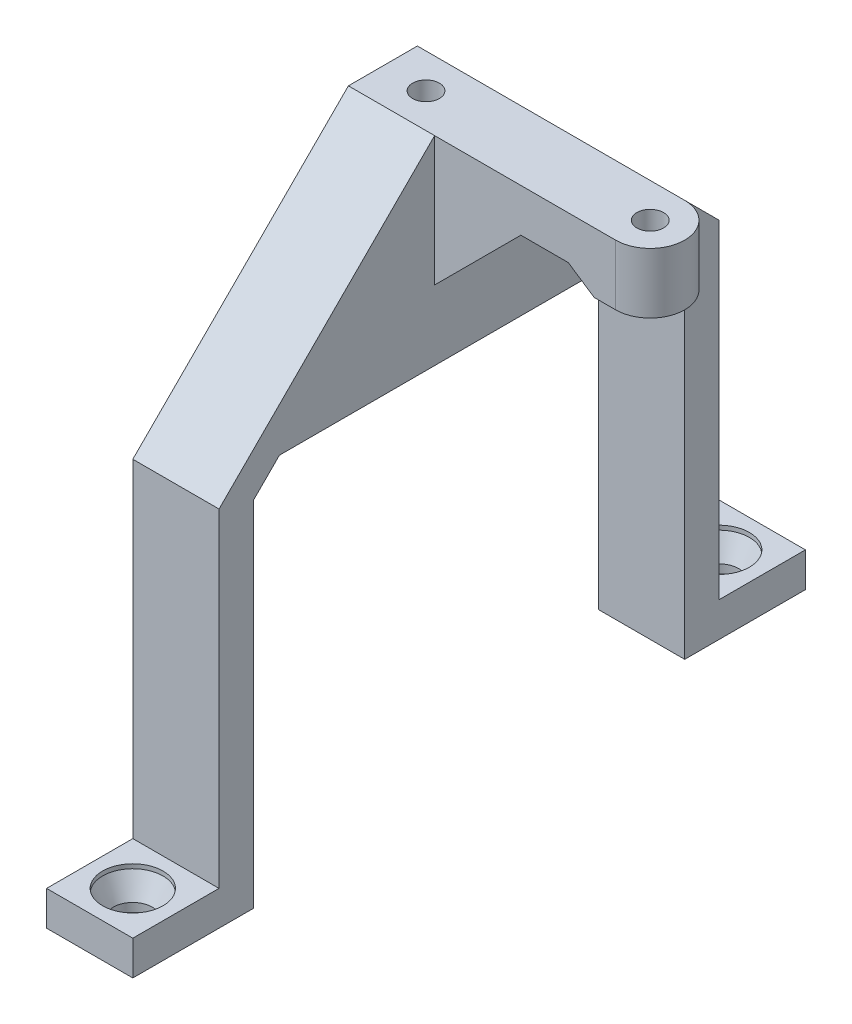
ISO-10303-21;
HEADER;
FILE_DESCRIPTION(('STEP AP214'),'2;1');
FILE_NAME('part.step','',(''),(''),'','','');
FILE_SCHEMA(('AUTOMOTIVE_DESIGN { 1 0 10303 214 1 1 1 1 }'));
ENDSEC;
DATA;
#1=APPLICATION_CONTEXT('core data for automotive mechanical design processes');
#2=APPLICATION_PROTOCOL_DEFINITION('international standard','automotive_design',2000,#1);
#3=PRODUCT_CONTEXT('',#1,'mechanical');
#4=PRODUCT('Part','Part','',(#3));
#5=PRODUCT_RELATED_PRODUCT_CATEGORY('part','',(#4));
#6=PRODUCT_DEFINITION_FORMATION('','',#4);
#7=PRODUCT_DEFINITION_CONTEXT('part definition',#1,'design');
#8=PRODUCT_DEFINITION('design','',#6,#7);
#9=PRODUCT_DEFINITION_SHAPE('','',#8);
#10=(LENGTH_UNIT() NAMED_UNIT(*) SI_UNIT(.MILLI.,.METRE.));
#11=(NAMED_UNIT(*) PLANE_ANGLE_UNIT() SI_UNIT($,.RADIAN.));
#12=(NAMED_UNIT(*) SI_UNIT($,.STERADIAN.) SOLID_ANGLE_UNIT());
#13=UNCERTAINTY_MEASURE_WITH_UNIT(LENGTH_MEASURE(1.E-05),#10,'distance_accuracy_value','');
#14=(GEOMETRIC_REPRESENTATION_CONTEXT(3) GLOBAL_UNCERTAINTY_ASSIGNED_CONTEXT((#13)) GLOBAL_UNIT_ASSIGNED_CONTEXT((#10,
#11,#12)) REPRESENTATION_CONTEXT('',''));
#15=CARTESIAN_POINT('',(0.,0.,0.));
#16=DIRECTION('',(0.,0.,1.));
#17=DIRECTION('',(1.,0.,0.));
#18=AXIS2_PLACEMENT_3D('',#15,#16,#17);
#19=CARTESIAN_POINT('',(-26.,-62.1,-34.));
#20=DIRECTION('',(0.,1.,0.));
#21=DIRECTION('',(0.,0.,1.));
#22=AXIS2_PLACEMENT_3D('',#19,#20,#21);
#23=CYLINDRICAL_SURFACE('',#22,2.25);
#24=CARTESIAN_POINT('',(-26.,-62.1,-34.));
#25=DIRECTION('',(0.,-1.,0.));
#26=DIRECTION('',(0.,0.,-1.));
#27=AXIS2_PLACEMENT_3D('',#24,#25,#26);
#28=CIRCLE('',#27,2.25);
#29=CARTESIAN_POINT('',(-26.,-62.1,-36.25));
#30=VERTEX_POINT('',#29);
#31=EDGE_CURVE('E413',#30,#30,#28,.T.);
#32=ORIENTED_EDGE('',*,*,#31,.T.);
#33=EDGE_LOOP('',(#32));
#34=FACE_BOUND('',#33,.T.);
#35=CARTESIAN_POINT('',(-26.,-61.1,-34.));
#36=DIRECTION('',(0.,1.,0.));
#37=DIRECTION('',(0.,0.,1.));
#38=AXIS2_PLACEMENT_3D('',#35,#36,#37);
#39=CIRCLE('',#38,2.25);
#40=CARTESIAN_POINT('',(-26.,-61.1,-31.75));
#41=VERTEX_POINT('',#40);
#42=EDGE_CURVE('E411',#41,#41,#39,.T.);
#43=ORIENTED_EDGE('',*,*,#42,.T.);
#44=EDGE_LOOP('',(#43));
#45=FACE_BOUND('',#44,.T.);
#46=ADVANCED_FACE('F56',(#34,#45),#23,.F.);
#47=CARTESIAN_POINT('',(-26.,-62.1,34.));
#48=DIRECTION('',(0.,1.,0.));
#49=DIRECTION('',(0.,0.,1.));
#50=AXIS2_PLACEMENT_3D('',#47,#48,#49);
#51=CYLINDRICAL_SURFACE('',#50,2.25);
#52=CARTESIAN_POINT('',(-26.,-62.1,34.));
#53=DIRECTION('',(0.,1.,0.));
#54=DIRECTION('',(0.,0.,1.));
#55=AXIS2_PLACEMENT_3D('',#52,#53,#54);
#56=CIRCLE('',#55,2.25);
#57=CARTESIAN_POINT('',(-26.,-62.1,36.25));
#58=VERTEX_POINT('',#57);
#59=EDGE_CURVE('E242',#58,#58,#56,.T.);
#60=ORIENTED_EDGE('',*,*,#59,.F.);
#61=EDGE_LOOP('',(#60));
#62=FACE_BOUND('',#61,.T.);
#63=CARTESIAN_POINT('',(-26.,-61.1,34.));
#64=DIRECTION('',(0.,1.,0.));
#65=DIRECTION('',(0.,0.,1.));
#66=AXIS2_PLACEMENT_3D('',#63,#64,#65);
#67=CIRCLE('',#66,2.25);
#68=CARTESIAN_POINT('',(-26.,-61.1,36.25));
#69=VERTEX_POINT('',#68);
#70=EDGE_CURVE('E406',#69,#69,#67,.F.);
#71=ORIENTED_EDGE('',*,*,#70,.F.);
#72=EDGE_LOOP('',(#71));
#73=FACE_BOUND('',#72,.T.);
#74=ADVANCED_FACE('F526',(#62,#73),#51,.F.);
#75=CARTESIAN_POINT('',(0.,5.,4.));
#76=DIRECTION('',(0.,0.,1.));
#77=DIRECTION('',(1.,0.,0.));
#78=AXIS2_PLACEMENT_3D('',#75,#76,#77);
#79=PLANE('',#78);
#80=DIRECTION('',(-1.,0.,0.));
#81=VECTOR('',#80,1.);
#82=CARTESIAN_POINT('',(0.,5.,4.));
#83=LINE('',#82,#81);
#84=CARTESIAN_POINT('',(0.,5.,4.));
#85=VERTEX_POINT('',#84);
#86=CARTESIAN_POINT('',(-21.,5.,4.));
#87=VERTEX_POINT('',#86);
#88=EDGE_CURVE('E376',#85,#87,#83,.T.);
#89=ORIENTED_EDGE('',*,*,#88,.T.);
#90=DIRECTION('',(0.,1.,0.));
#91=VECTOR('',#90,1.);
#92=CARTESIAN_POINT('',(-21.,5.,4.));
#93=LINE('',#92,#91);
#94=CARTESIAN_POINT('',(-21.,-10.0000000000001,4.));
#95=VERTEX_POINT('',#94);
#96=EDGE_CURVE('E252',#95,#87,#93,.T.);
#97=ORIENTED_EDGE('',*,*,#96,.F.);
#98=DIRECTION('',(-0.707106781186543,-0.707106781186552,0.));
#99=VECTOR('',#98,1.);
#100=CARTESIAN_POINT('',(-21.,-10.0000000000001,4.));
#101=LINE('',#100,#99);
#102=CARTESIAN_POINT('',(-11.,0.,4.));
#103=VERTEX_POINT('',#102);
#104=EDGE_CURVE('E72',#95,#103,#101,.F.);
#105=ORIENTED_EDGE('',*,*,#104,.T.);
#106=DIRECTION('',(-1.,0.,0.));
#107=VECTOR('',#106,1.);
#108=CARTESIAN_POINT('',(0.,0.,4.));
#109=LINE('',#108,#107);
#110=CARTESIAN_POINT('',(-5.49999999999998,0.,4.));
#111=VERTEX_POINT('',#110);
#112=EDGE_CURVE('E368',#111,#103,#109,.T.);
#113=ORIENTED_EDGE('',*,*,#112,.F.);
#114=DIRECTION('',(-0.832050294337842,0.554700196225231,0.));
#115=VECTOR('',#114,1.);
#116=CARTESIAN_POINT('',(-2.5,-2.,4.));
#117=LINE('',#116,#115);
#118=CARTESIAN_POINT('',(-2.5,-2.,4.));
#119=VERTEX_POINT('',#118);
#120=EDGE_CURVE('E397',#111,#119,#117,.F.);
#121=ORIENTED_EDGE('',*,*,#120,.T.);
#122=DIRECTION('',(-1.,0.,0.));
#123=VECTOR('',#122,1.);
#124=CARTESIAN_POINT('',(0.,-2.,4.));
#125=LINE('',#124,#123);
#126=CARTESIAN_POINT('',(0.,-2.,4.));
#127=VERTEX_POINT('',#126);
#128=EDGE_CURVE('E362',#127,#119,#125,.T.);
#129=ORIENTED_EDGE('',*,*,#128,.F.);
#130=DIRECTION('',(0.,-1.,0.));
#131=VECTOR('',#130,1.);
#132=CARTESIAN_POINT('',(0.,5.,4.));
#133=LINE('',#132,#131);
#134=EDGE_CURVE('E391',#85,#127,#133,.T.);
#135=ORIENTED_EDGE('',*,*,#134,.F.);
#136=EDGE_LOOP('',(#89,#97,#105,#113,#121,#129,#135));
#137=FACE_BOUND('',#136,.T.);
#138=ADVANCED_FACE('F489',(#137),#79,.T.);
#139=CARTESIAN_POINT('',(0.,5.,-4.));
#140=DIRECTION('',(0.,0.,1.));
#141=DIRECTION('',(1.,0.,0.));
#142=AXIS2_PLACEMENT_3D('',#139,#140,#141);
#143=PLANE('',#142);
#144=DIRECTION('',(0.,1.,0.));
#145=VECTOR('',#144,1.);
#146=CARTESIAN_POINT('',(-21.,5.,-4.));
#147=LINE('',#146,#145);
#148=CARTESIAN_POINT('',(-21.,-10.0000000000001,-4.));
#149=VERTEX_POINT('',#148);
#150=CARTESIAN_POINT('',(-21.,5.,-4.));
#151=VERTEX_POINT('',#150);
#152=EDGE_CURVE('E291',#149,#151,#147,.T.);
#153=ORIENTED_EDGE('',*,*,#152,.T.);
#154=DIRECTION('',(-1.,0.,0.));
#155=VECTOR('',#154,1.);
#156=CARTESIAN_POINT('',(0.,5.,-4.));
#157=LINE('',#156,#155);
#158=CARTESIAN_POINT('',(0.,5.,-4.));
#159=VERTEX_POINT('',#158);
#160=EDGE_CURVE('E382',#159,#151,#157,.T.);
#161=ORIENTED_EDGE('',*,*,#160,.F.);
#162=DIRECTION('',(0.,-1.,0.));
#163=VECTOR('',#162,1.);
#164=CARTESIAN_POINT('',(0.,5.,-4.));
#165=LINE('',#164,#163);
#166=CARTESIAN_POINT('',(0.,-2.,-4.));
#167=VERTEX_POINT('',#166);
#168=EDGE_CURVE('E387',#159,#167,#165,.T.);
#169=ORIENTED_EDGE('',*,*,#168,.T.);
#170=DIRECTION('',(1.,0.,0.));
#171=VECTOR('',#170,1.);
#172=CARTESIAN_POINT('',(-2.5,-2.,-4.));
#173=LINE('',#172,#171);
#174=CARTESIAN_POINT('',(-2.5,-2.,-4.));
#175=VERTEX_POINT('',#174);
#176=EDGE_CURVE('E356',#175,#167,#173,.T.);
#177=ORIENTED_EDGE('',*,*,#176,.F.);
#178=DIRECTION('',(0.832050294337842,-0.554700196225231,0.));
#179=VECTOR('',#178,1.);
#180=CARTESIAN_POINT('',(-4.00000000000001,-0.999999999999984,-4.));
#181=LINE('',#180,#179);
#182=CARTESIAN_POINT('',(-5.49999999999998,0.,-4.));
#183=VERTEX_POINT('',#182);
#184=EDGE_CURVE('E395',#175,#183,#181,.F.);
#185=ORIENTED_EDGE('',*,*,#184,.T.);
#186=DIRECTION('',(-1.,0.,0.));
#187=VECTOR('',#186,1.);
#188=CARTESIAN_POINT('',(0.,0.,-4.));
#189=LINE('',#188,#187);
#190=CARTESIAN_POINT('',(-11.,0.,-4.));
#191=VERTEX_POINT('',#190);
#192=EDGE_CURVE('E373',#183,#191,#189,.T.);
#193=ORIENTED_EDGE('',*,*,#192,.T.);
#194=DIRECTION('',(0.707106781186543,0.707106781186552,0.));
#195=VECTOR('',#194,1.);
#196=CARTESIAN_POINT('',(-3.00000000000008,8.00000000000005,-4.));
#197=LINE('',#196,#195);
#198=EDGE_CURVE('E403',#191,#149,#197,.F.);
#199=ORIENTED_EDGE('',*,*,#198,.T.);
#200=EDGE_LOOP('',(#153,#161,#169,#177,#185,#193,#199));
#201=FACE_BOUND('',#200,.T.);
#202=ADVANCED_FACE('F494',(#201),#143,.F.);
#203=CARTESIAN_POINT('',(0.,0.,0.));
#204=DIRECTION('',(0.,1.,0.));
#205=DIRECTION('',(0.,0.,1.));
#206=AXIS2_PLACEMENT_3D('',#203,#204,#205);
#207=PLANE('',#206);
#208=ORIENTED_EDGE('',*,*,#112,.T.);
#209=DIRECTION('',(0.,0.,-1.));
#210=VECTOR('',#209,1.);
#211=CARTESIAN_POINT('',(-11.,0.,-4.));
#212=LINE('',#211,#210);
#213=EDGE_CURVE('E79',#103,#191,#212,.T.);
#214=ORIENTED_EDGE('',*,*,#213,.T.);
#215=ORIENTED_EDGE('',*,*,#192,.F.);
#216=DIRECTION('',(0.,0.,1.));
#217=VECTOR('',#216,1.);
#218=CARTESIAN_POINT('',(-5.49999999999998,0.,4.));
#219=LINE('',#218,#217);
#220=EDGE_CURVE('E393',#183,#111,#219,.T.);
#221=ORIENTED_EDGE('',*,*,#220,.T.);
#222=EDGE_LOOP('',(#208,#214,#215,#221));
#223=FACE_BOUND('',#222,.T.);
#224=ADVANCED_FACE('F497',(#223),#207,.F.);
#225=CARTESIAN_POINT('',(0.,5.,0.));
#226=DIRECTION('',(0.,-1.,0.));
#227=DIRECTION('',(0.,0.,-1.));
#228=AXIS2_PLACEMENT_3D('',#225,#226,#227);
#229=CYLINDRICAL_SURFACE('',#228,4.);
#230=ORIENTED_EDGE('',*,*,#134,.T.);
#231=CARTESIAN_POINT('',(0.,-2.,0.));
#232=DIRECTION('',(0.,-1.,0.));
#233=DIRECTION('',(0.,0.,-1.));
#234=AXIS2_PLACEMENT_3D('',#231,#232,#233);
#235=CIRCLE('',#234,4.);
#236=EDGE_CURVE('E359',#167,#127,#235,.T.);
#237=ORIENTED_EDGE('',*,*,#236,.F.);
#238=ORIENTED_EDGE('',*,*,#168,.F.);
#239=CARTESIAN_POINT('',(0.,5.,0.));
#240=DIRECTION('',(0.,1.,0.));
#241=DIRECTION('',(0.,0.,1.));
#242=AXIS2_PLACEMENT_3D('',#239,#240,#241);
#243=CIRCLE('',#242,4.);
#244=EDGE_CURVE('E379',#85,#159,#243,.T.);
#245=ORIENTED_EDGE('',*,*,#244,.F.);
#246=EDGE_LOOP('',(#230,#237,#238,#245));
#247=FACE_BOUND('',#246,.T.);
#248=ADVANCED_FACE('F509',(#247),#229,.T.);
#249=CARTESIAN_POINT('',(0.,5.,0.));
#250=DIRECTION('',(0.,-1.,0.));
#251=DIRECTION('',(0.,0.,-1.));
#252=AXIS2_PLACEMENT_3D('',#249,#250,#251);
#253=CYLINDRICAL_SURFACE('',#252,1.55);
#254=CARTESIAN_POINT('',(0.,5.,0.));
#255=DIRECTION('',(0.,1.,0.));
#256=DIRECTION('',(0.,0.,1.));
#257=AXIS2_PLACEMENT_3D('',#254,#255,#256);
#258=CIRCLE('',#257,1.55);
#259=CARTESIAN_POINT('',(0.,5.,1.55));
#260=VERTEX_POINT('',#259);
#261=EDGE_CURVE('E372',#260,#260,#258,.T.);
#262=ORIENTED_EDGE('',*,*,#261,.T.);
#263=EDGE_LOOP('',(#262));
#264=FACE_BOUND('',#263,.T.);
#265=CARTESIAN_POINT('',(0.,-2.,0.));
#266=DIRECTION('',(0.,-1.,0.));
#267=DIRECTION('',(0.,0.,-1.));
#268=AXIS2_PLACEMENT_3D('',#265,#266,#267);
#269=CIRCLE('',#268,1.55);
#270=CARTESIAN_POINT('',(0.,-2.,-1.55));
#271=VERTEX_POINT('',#270);
#272=EDGE_CURVE('E353',#271,#271,#269,.T.);
#273=ORIENTED_EDGE('',*,*,#272,.T.);
#274=EDGE_LOOP('',(#273));
#275=FACE_BOUND('',#274,.T.);
#276=ADVANCED_FACE('F512',(#264,#275),#253,.F.);
#277=CARTESIAN_POINT('',(-26.,5.,0.));
#278=DIRECTION('',(0.,-1.,0.));
#279=DIRECTION('',(0.,0.,-1.));
#280=AXIS2_PLACEMENT_3D('',#277,#278,#279);
#281=CYLINDRICAL_SURFACE('',#280,1.55);
#282=CARTESIAN_POINT('',(-26.,5.,0.));
#283=DIRECTION('',(0.,1.,0.));
#284=DIRECTION('',(0.,0.,1.));
#285=AXIS2_PLACEMENT_3D('',#282,#283,#284);
#286=CIRCLE('',#285,1.55);
#287=CARTESIAN_POINT('',(-26.,5.,1.55));
#288=VERTEX_POINT('',#287);
#289=EDGE_CURVE('E369',#288,#288,#286,.T.);
#290=ORIENTED_EDGE('',*,*,#289,.T.);
#291=EDGE_LOOP('',(#290));
#292=FACE_BOUND('',#291,.T.);
#293=CARTESIAN_POINT('',(-26.,-18.1,0.));
#294=DIRECTION('',(0.,-1.,0.));
#295=DIRECTION('',(0.,0.,-1.));
#296=AXIS2_PLACEMENT_3D('',#293,#294,#295);
#297=CIRCLE('',#296,1.55);
#298=CARTESIAN_POINT('',(-26.,-18.1,-1.55));
#299=VERTEX_POINT('',#298);
#300=EDGE_CURVE('E331',#299,#299,#297,.T.);
#301=ORIENTED_EDGE('',*,*,#300,.T.);
#302=EDGE_LOOP('',(#301));
#303=FACE_BOUND('',#302,.T.);
#304=ADVANCED_FACE('F518',(#292,#303),#281,.F.);
#305=CARTESIAN_POINT('',(-31.,5.,0.));
#306=DIRECTION('',(1.,0.,0.));
#307=DIRECTION('',(0.,0.,-1.));
#308=AXIS2_PLACEMENT_3D('',#305,#306,#307);
#309=PLANE('',#308);
#310=DIRECTION('',(0.,0.,1.));
#311=VECTOR('',#310,1.);
#312=CARTESIAN_POINT('',(-31.,5.,0.));
#313=LINE('',#312,#311);
#314=CARTESIAN_POINT('',(-31.,5.,-4.));
#315=VERTEX_POINT('',#314);
#316=CARTESIAN_POINT('',(-31.,5.,4.));
#317=VERTEX_POINT('',#316);
#318=EDGE_CURVE('E385',#315,#317,#313,.T.);
#319=ORIENTED_EDGE('',*,*,#318,.F.);
#320=DIRECTION('',(0.,-0.707106781186551,-0.707106781186544));
#321=VECTOR('',#320,1.);
#322=CARTESIAN_POINT('',(-31.,-20.0000000000003,-29.));
#323=LINE('',#322,#321);
#324=CARTESIAN_POINT('',(-31.,-20.0000000000003,-29.));
#325=VERTEX_POINT('',#324);
#326=EDGE_CURVE('E315',#315,#325,#323,.T.);
#327=ORIENTED_EDGE('',*,*,#326,.T.);
#328=DIRECTION('',(0.,-1.,0.));
#329=VECTOR('',#328,1.);
#330=CARTESIAN_POINT('',(-31.,-20.0000000000003,-29.));
#331=LINE('',#330,#329);
#332=CARTESIAN_POINT('',(-31.,-58.1,-29.));
#333=VERTEX_POINT('',#332);
#334=EDGE_CURVE('E318',#325,#333,#331,.T.);
#335=ORIENTED_EDGE('',*,*,#334,.T.);
#336=DIRECTION('',(0.,0.,-1.));
#337=VECTOR('',#336,1.);
#338=CARTESIAN_POINT('',(-31.,-58.1,-29.));
#339=LINE('',#338,#337);
#340=CARTESIAN_POINT('',(-31.,-58.1,-39.));
#341=VERTEX_POINT('',#340);
#342=EDGE_CURVE('E321',#333,#341,#339,.T.);
#343=ORIENTED_EDGE('',*,*,#342,.T.);
#344=DIRECTION('',(0.,-1.,0.));
#345=VECTOR('',#344,1.);
#346=CARTESIAN_POINT('',(-31.,-58.1,-39.));
#347=LINE('',#346,#345);
#348=CARTESIAN_POINT('',(-31.,-62.1,-39.));
#349=VERTEX_POINT('',#348);
#350=EDGE_CURVE('E324',#341,#349,#347,.T.);
#351=ORIENTED_EDGE('',*,*,#350,.T.);
#352=DIRECTION('',(0.,0.,1.));
#353=VECTOR('',#352,1.);
#354=CARTESIAN_POINT('',(-31.,-62.1,-39.));
#355=LINE('',#354,#353);
#356=CARTESIAN_POINT('',(-31.,-62.1,-25.));
#357=VERTEX_POINT('',#356);
#358=EDGE_CURVE('E288',#349,#357,#355,.T.);
#359=ORIENTED_EDGE('',*,*,#358,.T.);
#360=DIRECTION('',(0.,1.,0.));
#361=VECTOR('',#360,1.);
#362=CARTESIAN_POINT('',(-31.,-21.1,-25.));
#363=LINE('',#362,#361);
#364=CARTESIAN_POINT('',(-31.,-21.1,-25.));
#365=VERTEX_POINT('',#364);
#366=EDGE_CURVE('E267',#357,#365,#363,.T.);
#367=ORIENTED_EDGE('',*,*,#366,.T.);
#368=DIRECTION('',(0.,0.70710678118655,0.707106781186545));
#369=VECTOR('',#368,1.);
#370=CARTESIAN_POINT('',(-31.,-18.1,-22.));
#371=LINE('',#370,#369);
#372=CARTESIAN_POINT('',(-31.,-18.1,-22.));
#373=VERTEX_POINT('',#372);
#374=EDGE_CURVE('E312',#365,#373,#371,.T.);
#375=ORIENTED_EDGE('',*,*,#374,.T.);
#376=DIRECTION('',(0.,0.,-1.));
#377=VECTOR('',#376,1.);
#378=CARTESIAN_POINT('',(-31.,-18.1,4.));
#379=LINE('',#378,#377);
#380=CARTESIAN_POINT('',(-31.,-18.1,22.));
#381=VERTEX_POINT('',#380);
#382=EDGE_CURVE('E349',#381,#373,#379,.T.);
#383=ORIENTED_EDGE('',*,*,#382,.F.);
#384=DIRECTION('',(0.,0.70710678118655,-0.707106781186545));
#385=VECTOR('',#384,1.);
#386=CARTESIAN_POINT('',(-31.,-18.1,22.));
#387=LINE('',#386,#385);
#388=CARTESIAN_POINT('',(-31.,-21.1,25.));
#389=VERTEX_POINT('',#388);
#390=EDGE_CURVE('E236',#389,#381,#387,.T.);
#391=ORIENTED_EDGE('',*,*,#390,.F.);
#392=DIRECTION('',(0.,1.,0.));
#393=VECTOR('',#392,1.);
#394=CARTESIAN_POINT('',(-31.,-21.1,25.));
#395=LINE('',#394,#393);
#396=CARTESIAN_POINT('',(-31.,-62.1,25.));
#397=VERTEX_POINT('',#396);
#398=EDGE_CURVE('E256',#397,#389,#395,.T.);
#399=ORIENTED_EDGE('',*,*,#398,.F.);
#400=DIRECTION('',(0.,0.,-1.));
#401=VECTOR('',#400,1.);
#402=CARTESIAN_POINT('',(-31.,-62.1,39.));
#403=LINE('',#402,#401);
#404=CARTESIAN_POINT('',(-31.,-62.1,39.));
#405=VERTEX_POINT('',#404);
#406=EDGE_CURVE('E226',#405,#397,#403,.T.);
#407=ORIENTED_EDGE('',*,*,#406,.F.);
#408=DIRECTION('',(0.,-1.,0.));
#409=VECTOR('',#408,1.);
#410=CARTESIAN_POINT('',(-31.,-58.1,39.));
#411=LINE('',#410,#409);
#412=CARTESIAN_POINT('',(-31.,-58.1,39.));
#413=VERTEX_POINT('',#412);
#414=EDGE_CURVE('E259',#413,#405,#411,.T.);
#415=ORIENTED_EDGE('',*,*,#414,.F.);
#416=DIRECTION('',(0.,0.,1.));
#417=VECTOR('',#416,1.);
#418=CARTESIAN_POINT('',(-31.,-58.1,29.));
#419=LINE('',#418,#417);
#420=CARTESIAN_POINT('',(-31.,-58.1,29.));
#421=VERTEX_POINT('',#420);
#422=EDGE_CURVE('E261',#421,#413,#419,.T.);
#423=ORIENTED_EDGE('',*,*,#422,.F.);
#424=DIRECTION('',(0.,-1.,0.));
#425=VECTOR('',#424,1.);
#426=CARTESIAN_POINT('',(-31.,-20.0000000000003,29.));
#427=LINE('',#426,#425);
#428=CARTESIAN_POINT('',(-31.,-20.0000000000003,29.));
#429=VERTEX_POINT('',#428);
#430=EDGE_CURVE('E263',#429,#421,#427,.T.);
#431=ORIENTED_EDGE('',*,*,#430,.F.);
#432=DIRECTION('',(0.,-0.707106781186551,0.707106781186544));
#433=VECTOR('',#432,1.);
#434=CARTESIAN_POINT('',(-31.,-20.0000000000003,29.));
#435=LINE('',#434,#433);
#436=EDGE_CURVE('E239',#317,#429,#435,.T.);
#437=ORIENTED_EDGE('',*,*,#436,.F.);
#438=EDGE_LOOP('',(#319,#327,#335,#343,#351,#359,#367,#375,#383,#391,#399,#407,#415,#423,#431,#437));
#439=FACE_BOUND('',#438,.T.);
#440=ADVANCED_FACE('F443',(#439),#309,.F.);
#441=CARTESIAN_POINT('',(0.,5.,0.));
#442=DIRECTION('',(0.,1.,0.));
#443=DIRECTION('',(0.,0.,1.));
#444=AXIS2_PLACEMENT_3D('',#441,#442,#443);
#445=PLANE('',#444);
#446=ORIENTED_EDGE('',*,*,#289,.F.);
#447=EDGE_LOOP('',(#446));
#448=FACE_BOUND('',#447,.T.);
#449=ORIENTED_EDGE('',*,*,#261,.F.);
#450=EDGE_LOOP('',(#449));
#451=FACE_BOUND('',#450,.T.);
#452=ORIENTED_EDGE('',*,*,#88,.F.);
#453=ORIENTED_EDGE('',*,*,#244,.T.);
#454=ORIENTED_EDGE('',*,*,#160,.T.);
#455=DIRECTION('',(-1.,0.,0.));
#456=VECTOR('',#455,1.);
#457=CARTESIAN_POINT('',(-21.,5.,-4.));
#458=LINE('',#457,#456);
#459=EDGE_CURVE('E340',#151,#315,#458,.T.);
#460=ORIENTED_EDGE('',*,*,#459,.T.);
#461=ORIENTED_EDGE('',*,*,#318,.T.);
#462=DIRECTION('',(-1.,0.,0.));
#463=VECTOR('',#462,1.);
#464=CARTESIAN_POINT('',(-21.,5.,4.));
#465=LINE('',#464,#463);
#466=EDGE_CURVE('E271',#87,#317,#465,.T.);
#467=ORIENTED_EDGE('',*,*,#466,.F.);
#468=EDGE_LOOP('',(#452,#453,#454,#460,#461,#467));
#469=FACE_BOUND('',#468,.T.);
#470=ADVANCED_FACE('F480',(#448,#451,#469),#445,.T.);
#471=CARTESIAN_POINT('',(0.,-2.,0.));
#472=DIRECTION('',(0.,-1.,0.));
#473=DIRECTION('',(0.,0.,-1.));
#474=AXIS2_PLACEMENT_3D('',#471,#472,#473);
#475=PLANE('',#474);
#476=ORIENTED_EDGE('',*,*,#176,.T.);
#477=ORIENTED_EDGE('',*,*,#236,.T.);
#478=ORIENTED_EDGE('',*,*,#128,.T.);
#479=DIRECTION('',(0.,0.,-1.));
#480=VECTOR('',#479,1.);
#481=CARTESIAN_POINT('',(-2.5,-2.,4.));
#482=LINE('',#481,#480);
#483=EDGE_CURVE('E365',#119,#175,#482,.T.);
#484=ORIENTED_EDGE('',*,*,#483,.T.);
#485=EDGE_LOOP('',(#476,#477,#478,#484));
#486=FACE_BOUND('',#485,.T.);
#487=ORIENTED_EDGE('',*,*,#272,.F.);
#488=EDGE_LOOP('',(#487));
#489=FACE_BOUND('',#488,.T.);
#490=ADVANCED_FACE('F504',(#486,#489),#475,.T.);
#491=CARTESIAN_POINT('',(-2.5,-2.,4.));
#492=DIRECTION('',(-0.554700196225231,-0.832050294337842,0.));
#493=DIRECTION('',(0.,0.,1.));
#494=AXIS2_PLACEMENT_3D('',#491,#492,#493);
#495=PLANE('',#494);
#496=ORIENTED_EDGE('',*,*,#120,.F.);
#497=ORIENTED_EDGE('',*,*,#220,.F.);
#498=ORIENTED_EDGE('',*,*,#184,.F.);
#499=ORIENTED_EDGE('',*,*,#483,.F.);
#500=EDGE_LOOP('',(#496,#497,#498,#499));
#501=FACE_BOUND('',#500,.T.);
#502=ADVANCED_FACE('F500',(#501),#495,.T.);
#503=CARTESIAN_POINT('',(0.,-18.1,0.));
#504=DIRECTION('',(0.,-1.,0.));
#505=DIRECTION('',(0.,0.,-1.));
#506=AXIS2_PLACEMENT_3D('',#503,#504,#505);
#507=PLANE('',#506);
#508=ORIENTED_EDGE('',*,*,#382,.T.);
#509=DIRECTION('',(-1.,0.,0.));
#510=VECTOR('',#509,1.);
#511=CARTESIAN_POINT('',(-21.,-18.1,-22.));
#512=LINE('',#511,#510);
#513=CARTESIAN_POINT('',(-21.,-18.1,-22.));
#514=VERTEX_POINT('',#513);
#515=EDGE_CURVE('E343',#514,#373,#512,.T.);
#516=ORIENTED_EDGE('',*,*,#515,.F.);
#517=DIRECTION('',(0.,0.,1.));
#518=VECTOR('',#517,1.);
#519=CARTESIAN_POINT('',(-21.,-18.1,4.));
#520=LINE('',#519,#518);
#521=CARTESIAN_POINT('',(-21.,-18.1,22.));
#522=VERTEX_POINT('',#521);
#523=EDGE_CURVE('E351',#514,#522,#520,.T.);
#524=ORIENTED_EDGE('',*,*,#523,.T.);
#525=DIRECTION('',(-1.,0.,0.));
#526=VECTOR('',#525,1.);
#527=CARTESIAN_POINT('',(-21.,-18.1,22.));
#528=LINE('',#527,#526);
#529=EDGE_CURVE('E268',#522,#381,#528,.T.);
#530=ORIENTED_EDGE('',*,*,#529,.T.);
#531=EDGE_LOOP('',(#508,#516,#524,#530));
#532=FACE_BOUND('',#531,.T.);
#533=ORIENTED_EDGE('',*,*,#300,.F.);
#534=EDGE_LOOP('',(#533));
#535=FACE_BOUND('',#534,.T.);
#536=ADVANCED_FACE('F451',(#532,#535),#507,.T.);
#537=CARTESIAN_POINT('',(-21.,-18.1,4.));
#538=DIRECTION('',(-1.,0.,0.));
#539=DIRECTION('',(0.,0.,1.));
#540=AXIS2_PLACEMENT_3D('',#537,#538,#539);
#541=PLANE('',#540);
#542=DIRECTION('',(0.,0.,1.));
#543=VECTOR('',#542,1.);
#544=CARTESIAN_POINT('',(-21.,-10.0000000000001,4.));
#545=LINE('',#544,#543);
#546=EDGE_CURVE('E399',#149,#95,#545,.T.);
#547=ORIENTED_EDGE('',*,*,#546,.T.);
#548=ORIENTED_EDGE('',*,*,#96,.T.);
#549=DIRECTION('',(0.,-0.707106781186551,0.707106781186544));
#550=VECTOR('',#549,1.);
#551=CARTESIAN_POINT('',(-21.,-20.0000000000003,29.));
#552=LINE('',#551,#550);
#553=CARTESIAN_POINT('',(-21.,-20.0000000000003,29.));
#554=VERTEX_POINT('',#553);
#555=EDGE_CURVE('E250',#87,#554,#552,.T.);
#556=ORIENTED_EDGE('',*,*,#555,.T.);
#557=DIRECTION('',(0.,-1.,0.));
#558=VECTOR('',#557,1.);
#559=CARTESIAN_POINT('',(-21.,-20.0000000000003,29.));
#560=LINE('',#559,#558);
#561=CARTESIAN_POINT('',(-21.,-58.1,29.));
#562=VERTEX_POINT('',#561);
#563=EDGE_CURVE('E248',#554,#562,#560,.T.);
#564=ORIENTED_EDGE('',*,*,#563,.T.);
#565=DIRECTION('',(0.,0.,1.));
#566=VECTOR('',#565,1.);
#567=CARTESIAN_POINT('',(-21.,-58.1,29.));
#568=LINE('',#567,#566);
#569=CARTESIAN_POINT('',(-21.,-58.1,39.));
#570=VERTEX_POINT('',#569);
#571=EDGE_CURVE('E246',#562,#570,#568,.T.);
#572=ORIENTED_EDGE('',*,*,#571,.T.);
#573=DIRECTION('',(0.,-1.,0.));
#574=VECTOR('',#573,1.);
#575=CARTESIAN_POINT('',(-21.,-58.1,39.));
#576=LINE('',#575,#574);
#577=CARTESIAN_POINT('',(-21.,-62.1,39.));
#578=VERTEX_POINT('',#577);
#579=EDGE_CURVE('E217',#570,#578,#576,.T.);
#580=ORIENTED_EDGE('',*,*,#579,.T.);
#581=DIRECTION('',(0.,0.,-1.));
#582=VECTOR('',#581,1.);
#583=CARTESIAN_POINT('',(-21.,-62.1,39.));
#584=LINE('',#583,#582);
#585=CARTESIAN_POINT('',(-21.,-62.1,25.));
#586=VERTEX_POINT('',#585);
#587=EDGE_CURVE('E208',#578,#586,#584,.T.);
#588=ORIENTED_EDGE('',*,*,#587,.T.);
#589=DIRECTION('',(0.,1.,0.));
#590=VECTOR('',#589,1.);
#591=CARTESIAN_POINT('',(-21.,-21.1,25.));
#592=LINE('',#591,#590);
#593=CARTESIAN_POINT('',(-21.,-21.1,25.));
#594=VERTEX_POINT('',#593);
#595=EDGE_CURVE('E214',#586,#594,#592,.T.);
#596=ORIENTED_EDGE('',*,*,#595,.T.);
#597=DIRECTION('',(0.,0.70710678118655,-0.707106781186545));
#598=VECTOR('',#597,1.);
#599=CARTESIAN_POINT('',(-21.,-18.1,22.));
#600=LINE('',#599,#598);
#601=EDGE_CURVE('E231',#594,#522,#600,.T.);
#602=ORIENTED_EDGE('',*,*,#601,.T.);
#603=ORIENTED_EDGE('',*,*,#523,.F.);
#604=DIRECTION('',(0.,0.70710678118655,0.707106781186545));
#605=VECTOR('',#604,1.);
#606=CARTESIAN_POINT('',(-21.,-18.1,-22.));
#607=LINE('',#606,#605);
#608=CARTESIAN_POINT('',(-21.,-21.1,-25.));
#609=VERTEX_POINT('',#608);
#610=EDGE_CURVE('E287',#609,#514,#607,.T.);
#611=ORIENTED_EDGE('',*,*,#610,.F.);
#612=DIRECTION('',(0.,1.,0.));
#613=VECTOR('',#612,1.);
#614=CARTESIAN_POINT('',(-21.,-21.1,-25.));
#615=LINE('',#614,#613);
#616=CARTESIAN_POINT('',(-21.,-62.1,-25.));
#617=VERTEX_POINT('',#616);
#618=EDGE_CURVE('E284',#617,#609,#615,.T.);
#619=ORIENTED_EDGE('',*,*,#618,.F.);
#620=DIRECTION('',(0.,0.,1.));
#621=VECTOR('',#620,1.);
#622=CARTESIAN_POINT('',(-21.,-62.1,-39.));
#623=LINE('',#622,#621);
#624=CARTESIAN_POINT('',(-21.,-62.1,-39.));
#625=VERTEX_POINT('',#624);
#626=EDGE_CURVE('E306',#625,#617,#623,.T.);
#627=ORIENTED_EDGE('',*,*,#626,.F.);
#628=DIRECTION('',(0.,-1.,0.));
#629=VECTOR('',#628,1.);
#630=CARTESIAN_POINT('',(-21.,-58.1,-39.));
#631=LINE('',#630,#629);
#632=CARTESIAN_POINT('',(-21.,-58.1,-39.));
#633=VERTEX_POINT('',#632);
#634=EDGE_CURVE('E303',#633,#625,#631,.T.);
#635=ORIENTED_EDGE('',*,*,#634,.F.);
#636=DIRECTION('',(0.,0.,-1.));
#637=VECTOR('',#636,1.);
#638=CARTESIAN_POINT('',(-21.,-58.1,-29.));
#639=LINE('',#638,#637);
#640=CARTESIAN_POINT('',(-21.,-58.1,-29.));
#641=VERTEX_POINT('',#640);
#642=EDGE_CURVE('E300',#641,#633,#639,.T.);
#643=ORIENTED_EDGE('',*,*,#642,.F.);
#644=DIRECTION('',(0.,-1.,0.));
#645=VECTOR('',#644,1.);
#646=CARTESIAN_POINT('',(-21.,-20.0000000000003,-29.));
#647=LINE('',#646,#645);
#648=CARTESIAN_POINT('',(-21.,-20.0000000000003,-29.));
#649=VERTEX_POINT('',#648);
#650=EDGE_CURVE('E297',#649,#641,#647,.T.);
#651=ORIENTED_EDGE('',*,*,#650,.F.);
#652=DIRECTION('',(0.,-0.707106781186551,-0.707106781186544));
#653=VECTOR('',#652,1.);
#654=CARTESIAN_POINT('',(-21.,-20.0000000000003,-29.));
#655=LINE('',#654,#653);
#656=EDGE_CURVE('E294',#151,#649,#655,.T.);
#657=ORIENTED_EDGE('',*,*,#656,.F.);
#658=ORIENTED_EDGE('',*,*,#152,.F.);
#659=EDGE_LOOP('',(#547,#548,#556,#564,#572,#580,#588,#596,#602,#603,#611,#619,#627,#635,#643,
#651,#657,#658));
#660=FACE_BOUND('',#659,.T.);
#661=ADVANCED_FACE('F211',(#660),#541,.F.);
#662=CARTESIAN_POINT('',(-21.,-21.1,-25.));
#663=DIRECTION('',(0.,0.,1.));
#664=DIRECTION('',(0.,-1.,0.));
#665=AXIS2_PLACEMENT_3D('',#662,#663,#664);
#666=PLANE('',#665);
#667=ORIENTED_EDGE('',*,*,#366,.F.);
#668=DIRECTION('',(-1.,0.,0.));
#669=VECTOR('',#668,1.);
#670=CARTESIAN_POINT('',(-21.,-62.1,-25.));
#671=LINE('',#670,#669);
#672=EDGE_CURVE('E329',#617,#357,#671,.T.);
#673=ORIENTED_EDGE('',*,*,#672,.F.);
#674=ORIENTED_EDGE('',*,*,#618,.T.);
#675=DIRECTION('',(-1.,0.,0.));
#676=VECTOR('',#675,1.);
#677=CARTESIAN_POINT('',(-21.,-21.1,-25.));
#678=LINE('',#677,#676);
#679=EDGE_CURVE('E309',#609,#365,#678,.T.);
#680=ORIENTED_EDGE('',*,*,#679,.T.);
#681=EDGE_LOOP('',(#667,#673,#674,#680));
#682=FACE_BOUND('',#681,.T.);
#683=ADVANCED_FACE('F458',(#682),#666,.T.);
#684=CARTESIAN_POINT('',(-21.,-62.1,-39.));
#685=DIRECTION('',(0.,-1.,0.));
#686=DIRECTION('',(0.,0.,-1.));
#687=AXIS2_PLACEMENT_3D('',#684,#685,#686);
#688=PLANE('',#687);
#689=ORIENTED_EDGE('',*,*,#31,.F.);
#690=EDGE_LOOP('',(#689));
#691=FACE_BOUND('',#690,.T.);
#692=ORIENTED_EDGE('',*,*,#358,.F.);
#693=DIRECTION('',(-1.,0.,0.));
#694=VECTOR('',#693,1.);
#695=CARTESIAN_POINT('',(-21.,-62.1,-39.));
#696=LINE('',#695,#694);
#697=EDGE_CURVE('E332',#625,#349,#696,.T.);
#698=ORIENTED_EDGE('',*,*,#697,.F.);
#699=ORIENTED_EDGE('',*,*,#626,.T.);
#700=ORIENTED_EDGE('',*,*,#672,.T.);
#701=EDGE_LOOP('',(#692,#698,#699,#700));
#702=FACE_BOUND('',#701,.T.);
#703=ADVANCED_FACE('F463',(#691,#702),#688,.T.);
#704=CARTESIAN_POINT('',(-21.,-58.1,-39.));
#705=DIRECTION('',(0.,0.,-1.));
#706=DIRECTION('',(-1.,0.,0.));
#707=AXIS2_PLACEMENT_3D('',#704,#705,#706);
#708=PLANE('',#707);
#709=ORIENTED_EDGE('',*,*,#350,.F.);
#710=DIRECTION('',(-1.,0.,0.));
#711=VECTOR('',#710,1.);
#712=CARTESIAN_POINT('',(-21.,-58.1,-39.));
#713=LINE('',#712,#711);
#714=EDGE_CURVE('E334',#633,#341,#713,.T.);
#715=ORIENTED_EDGE('',*,*,#714,.F.);
#716=ORIENTED_EDGE('',*,*,#634,.T.);
#717=ORIENTED_EDGE('',*,*,#697,.T.);
#718=EDGE_LOOP('',(#709,#715,#716,#717));
#719=FACE_BOUND('',#718,.T.);
#720=ADVANCED_FACE('F466',(#719),#708,.T.);
#721=CARTESIAN_POINT('',(-21.,-58.1,-29.));
#722=DIRECTION('',(0.,1.,0.));
#723=DIRECTION('',(0.,0.,1.));
#724=AXIS2_PLACEMENT_3D('',#721,#722,#723);
#725=PLANE('',#724);
#726=CARTESIAN_POINT('',(-26.,-58.1,-34.));
#727=DIRECTION('',(0.,-1.,0.));
#728=DIRECTION('',(0.,0.,-1.));
#729=AXIS2_PLACEMENT_3D('',#726,#727,#728);
#730=CIRCLE('',#729,3.5);
#731=CARTESIAN_POINT('',(-26.,-58.1,-37.5));
#732=VERTEX_POINT('',#731);
#733=EDGE_CURVE('E414',#732,#732,#730,.T.);
#734=ORIENTED_EDGE('',*,*,#733,.T.);
#735=EDGE_LOOP('',(#734));
#736=FACE_BOUND('',#735,.T.);
#737=ORIENTED_EDGE('',*,*,#342,.F.);
#738=DIRECTION('',(-1.,0.,0.));
#739=VECTOR('',#738,1.);
#740=CARTESIAN_POINT('',(-21.,-58.1,-29.));
#741=LINE('',#740,#739);
#742=EDGE_CURVE('E336',#641,#333,#741,.T.);
#743=ORIENTED_EDGE('',*,*,#742,.F.);
#744=ORIENTED_EDGE('',*,*,#642,.T.);
#745=ORIENTED_EDGE('',*,*,#714,.T.);
#746=EDGE_LOOP('',(#737,#743,#744,#745));
#747=FACE_BOUND('',#746,.T.);
#748=ADVANCED_FACE('F471',(#736,#747),#725,.T.);
#749=CARTESIAN_POINT('',(-21.,-20.0000000000003,-29.));
#750=DIRECTION('',(0.,0.,-1.));
#751=DIRECTION('',(0.,1.,0.));
#752=AXIS2_PLACEMENT_3D('',#749,#750,#751);
#753=PLANE('',#752);
#754=ORIENTED_EDGE('',*,*,#334,.F.);
#755=DIRECTION('',(-1.,0.,0.));
#756=VECTOR('',#755,1.);
#757=CARTESIAN_POINT('',(-21.,-20.0000000000003,-29.));
#758=LINE('',#757,#756);
#759=EDGE_CURVE('E338',#649,#325,#758,.T.);
#760=ORIENTED_EDGE('',*,*,#759,.F.);
#761=ORIENTED_EDGE('',*,*,#650,.T.);
#762=ORIENTED_EDGE('',*,*,#742,.T.);
#763=EDGE_LOOP('',(#754,#760,#761,#762));
#764=FACE_BOUND('',#763,.T.);
#765=ADVANCED_FACE('F474',(#764),#753,.T.);
#766=CARTESIAN_POINT('',(-21.,-20.0000000000003,-29.));
#767=DIRECTION('',(0.,0.707106781186544,-0.707106781186552));
#768=DIRECTION('',(0.,0.707106781186551,0.707106781186544));
#769=AXIS2_PLACEMENT_3D('',#766,#767,#768);
#770=PLANE('',#769);
#771=ORIENTED_EDGE('',*,*,#326,.F.);
#772=ORIENTED_EDGE('',*,*,#459,.F.);
#773=ORIENTED_EDGE('',*,*,#656,.T.);
#774=ORIENTED_EDGE('',*,*,#759,.T.);
#775=EDGE_LOOP('',(#771,#772,#773,#774));
#776=FACE_BOUND('',#775,.T.);
#777=ADVANCED_FACE('F477',(#776),#770,.T.);
#778=CARTESIAN_POINT('',(-21.,-18.1,-22.));
#779=DIRECTION('',(0.,-0.707106781186545,0.70710678118655));
#780=DIRECTION('',(0.,-0.70710678118655,-0.707106781186545));
#781=AXIS2_PLACEMENT_3D('',#778,#779,#780);
#782=PLANE('',#781);
#783=ORIENTED_EDGE('',*,*,#374,.F.);
#784=ORIENTED_EDGE('',*,*,#679,.F.);
#785=ORIENTED_EDGE('',*,*,#610,.T.);
#786=ORIENTED_EDGE('',*,*,#515,.T.);
#787=EDGE_LOOP('',(#783,#784,#785,#786));
#788=FACE_BOUND('',#787,.T.);
#789=ADVANCED_FACE('F455',(#788),#782,.T.);
#790=CARTESIAN_POINT('',(-21.,-21.1,25.));
#791=DIRECTION('',(0.,0.,1.));
#792=DIRECTION('',(0.,-1.,0.));
#793=AXIS2_PLACEMENT_3D('',#790,#791,#792);
#794=PLANE('',#793);
#795=ORIENTED_EDGE('',*,*,#398,.T.);
#796=DIRECTION('',(-1.,0.,0.));
#797=VECTOR('',#796,1.);
#798=CARTESIAN_POINT('',(-21.,-21.1,25.));
#799=LINE('',#798,#797);
#800=EDGE_CURVE('E235',#594,#389,#799,.T.);
#801=ORIENTED_EDGE('',*,*,#800,.F.);
#802=ORIENTED_EDGE('',*,*,#595,.F.);
#803=DIRECTION('',(-1.,0.,0.));
#804=VECTOR('',#803,1.);
#805=CARTESIAN_POINT('',(-21.,-62.1,25.));
#806=LINE('',#805,#804);
#807=EDGE_CURVE('E223',#586,#397,#806,.T.);
#808=ORIENTED_EDGE('',*,*,#807,.T.);
#809=EDGE_LOOP('',(#795,#801,#802,#808));
#810=FACE_BOUND('',#809,.T.);
#811=ADVANCED_FACE('F233',(#810),#794,.F.);
#812=CARTESIAN_POINT('',(-21.,-18.1,22.));
#813=DIRECTION('',(0.,0.707106781186545,0.70710678118655));
#814=DIRECTION('',(0.,-0.70710678118655,0.707106781186545));
#815=AXIS2_PLACEMENT_3D('',#812,#813,#814);
#816=PLANE('',#815);
#817=ORIENTED_EDGE('',*,*,#390,.T.);
#818=ORIENTED_EDGE('',*,*,#529,.F.);
#819=ORIENTED_EDGE('',*,*,#601,.F.);
#820=ORIENTED_EDGE('',*,*,#800,.T.);
#821=EDGE_LOOP('',(#817,#818,#819,#820));
#822=FACE_BOUND('',#821,.T.);
#823=ADVANCED_FACE('F446',(#822),#816,.F.);
#824=CARTESIAN_POINT('',(-21.,-20.0000000000003,29.));
#825=DIRECTION('',(0.,-0.707106781186544,-0.707106781186552));
#826=DIRECTION('',(0.,0.707106781186551,-0.707106781186544));
#827=AXIS2_PLACEMENT_3D('',#824,#825,#826);
#828=PLANE('',#827);
#829=ORIENTED_EDGE('',*,*,#436,.T.);
#830=DIRECTION('',(-1.,0.,0.));
#831=VECTOR('',#830,1.);
#832=CARTESIAN_POINT('',(-21.,-20.0000000000003,29.));
#833=LINE('',#832,#831);
#834=EDGE_CURVE('E274',#554,#429,#833,.T.);
#835=ORIENTED_EDGE('',*,*,#834,.F.);
#836=ORIENTED_EDGE('',*,*,#555,.F.);
#837=ORIENTED_EDGE('',*,*,#466,.T.);
#838=EDGE_LOOP('',(#829,#835,#836,#837));
#839=FACE_BOUND('',#838,.T.);
#840=ADVANCED_FACE('F484',(#839),#828,.F.);
#841=CARTESIAN_POINT('',(-21.,-20.0000000000003,29.));
#842=DIRECTION('',(0.,0.,-1.));
#843=DIRECTION('',(0.,1.,0.));
#844=AXIS2_PLACEMENT_3D('',#841,#842,#843);
#845=PLANE('',#844);
#846=ORIENTED_EDGE('',*,*,#430,.T.);
#847=DIRECTION('',(-1.,0.,0.));
#848=VECTOR('',#847,1.);
#849=CARTESIAN_POINT('',(-21.,-58.1,29.));
#850=LINE('',#849,#848);
#851=EDGE_CURVE('E277',#562,#421,#850,.T.);
#852=ORIENTED_EDGE('',*,*,#851,.F.);
#853=ORIENTED_EDGE('',*,*,#563,.F.);
#854=ORIENTED_EDGE('',*,*,#834,.T.);
#855=EDGE_LOOP('',(#846,#852,#853,#854));
#856=FACE_BOUND('',#855,.T.);
#857=ADVANCED_FACE('F432',(#856),#845,.F.);
#858=CARTESIAN_POINT('',(-21.,-58.1,29.));
#859=DIRECTION('',(0.,-1.,0.));
#860=DIRECTION('',(0.,0.,-1.));
#861=AXIS2_PLACEMENT_3D('',#858,#859,#860);
#862=PLANE('',#861);
#863=CARTESIAN_POINT('',(-26.,-58.1,34.));
#864=DIRECTION('',(0.,1.,0.));
#865=DIRECTION('',(0.,0.,1.));
#866=AXIS2_PLACEMENT_3D('',#863,#864,#865);
#867=CIRCLE('',#866,3.5);
#868=CARTESIAN_POINT('',(-26.,-58.1,37.5));
#869=VERTEX_POINT('',#868);
#870=EDGE_CURVE('E409',#869,#869,#867,.T.);
#871=ORIENTED_EDGE('',*,*,#870,.F.);
#872=EDGE_LOOP('',(#871));
#873=FACE_BOUND('',#872,.T.);
#874=ORIENTED_EDGE('',*,*,#422,.T.);
#875=DIRECTION('',(-1.,0.,0.));
#876=VECTOR('',#875,1.);
#877=CARTESIAN_POINT('',(-21.,-58.1,39.));
#878=LINE('',#877,#876);
#879=EDGE_CURVE('E280',#570,#413,#878,.T.);
#880=ORIENTED_EDGE('',*,*,#879,.F.);
#881=ORIENTED_EDGE('',*,*,#571,.F.);
#882=ORIENTED_EDGE('',*,*,#851,.T.);
#883=EDGE_LOOP('',(#874,#880,#881,#882));
#884=FACE_BOUND('',#883,.T.);
#885=ADVANCED_FACE('F428',(#873,#884),#862,.F.);
#886=CARTESIAN_POINT('',(-21.,-58.1,39.));
#887=DIRECTION('',(0.,0.,-1.));
#888=DIRECTION('',(-1.,0.,0.));
#889=AXIS2_PLACEMENT_3D('',#886,#887,#888);
#890=PLANE('',#889);
#891=ORIENTED_EDGE('',*,*,#414,.T.);
#892=DIRECTION('',(-1.,0.,0.));
#893=VECTOR('',#892,1.);
#894=CARTESIAN_POINT('',(-21.,-62.1,39.));
#895=LINE('',#894,#893);
#896=EDGE_CURVE('E230',#578,#405,#895,.T.);
#897=ORIENTED_EDGE('',*,*,#896,.F.);
#898=ORIENTED_EDGE('',*,*,#579,.F.);
#899=ORIENTED_EDGE('',*,*,#879,.T.);
#900=EDGE_LOOP('',(#891,#897,#898,#899));
#901=FACE_BOUND('',#900,.T.);
#902=ADVANCED_FACE('F431',(#901),#890,.F.);
#903=CARTESIAN_POINT('',(-21.,-62.1,39.));
#904=DIRECTION('',(0.,1.,0.));
#905=DIRECTION('',(0.,0.,1.));
#906=AXIS2_PLACEMENT_3D('',#903,#904,#905);
#907=PLANE('',#906);
#908=ORIENTED_EDGE('',*,*,#59,.T.);
#909=EDGE_LOOP('',(#908));
#910=FACE_BOUND('',#909,.T.);
#911=ORIENTED_EDGE('',*,*,#406,.T.);
#912=ORIENTED_EDGE('',*,*,#807,.F.);
#913=ORIENTED_EDGE('',*,*,#587,.F.);
#914=ORIENTED_EDGE('',*,*,#896,.T.);
#915=EDGE_LOOP('',(#911,#912,#913,#914));
#916=FACE_BOUND('',#915,.T.);
#917=ADVANCED_FACE('F224',(#910,#916),#907,.F.);
#918=CARTESIAN_POINT('',(-21.,-10.0000000000001,4.));
#919=DIRECTION('',(0.707106781186552,-0.707106781186543,0.));
#920=DIRECTION('',(0.,0.,-1.));
#921=AXIS2_PLACEMENT_3D('',#918,#919,#920);
#922=PLANE('',#921);
#923=ORIENTED_EDGE('',*,*,#198,.F.);
#924=ORIENTED_EDGE('',*,*,#213,.F.);
#925=ORIENTED_EDGE('',*,*,#104,.F.);
#926=ORIENTED_EDGE('',*,*,#546,.F.);
#927=EDGE_LOOP('',(#923,#924,#925,#926));
#928=FACE_BOUND('',#927,.T.);
#929=ADVANCED_FACE('F492',(#928),#922,.T.);
#930=CARTESIAN_POINT('',(-26.,-61.1,34.));
#931=DIRECTION('',(0.,1.,0.));
#932=DIRECTION('',(0.,0.,1.));
#933=AXIS2_PLACEMENT_3D('',#930,#931,#932);
#934=CYLINDRICAL_SURFACE('',#933,3.5);
#935=CARTESIAN_POINT('',(-26.,-58.6,34.));
#936=DIRECTION('',(0.,1.,0.));
#937=DIRECTION('',(0.,0.,1.));
#938=AXIS2_PLACEMENT_3D('',#935,#936,#937);
#939=CIRCLE('',#938,3.5);
#940=CARTESIAN_POINT('',(-26.,-58.6,37.5));
#941=VERTEX_POINT('',#940);
#942=EDGE_CURVE('E65',#941,#941,#939,.F.);
#943=ORIENTED_EDGE('',*,*,#942,.T.);
#944=EDGE_LOOP('',(#943));
#945=FACE_BOUND('',#944,.T.);
#946=ORIENTED_EDGE('',*,*,#870,.T.);
#947=EDGE_LOOP('',(#946));
#948=FACE_BOUND('',#947,.T.);
#949=ADVANCED_FACE('F426',(#945,#948),#934,.F.);
#950=CARTESIAN_POINT('',(-26.,-61.1,34.));
#951=DIRECTION('',(0.,1.,0.));
#952=DIRECTION('',(0.,0.,1.));
#953=AXIS2_PLACEMENT_3D('',#950,#951,#952);
#954=CONICAL_SURFACE('',#953,2.25000000000001,0.463647609000807);
#955=ORIENTED_EDGE('',*,*,#942,.F.);
#956=EDGE_LOOP('',(#955));
#957=FACE_BOUND('',#956,.T.);
#958=ORIENTED_EDGE('',*,*,#70,.T.);
#959=EDGE_LOOP('',(#958));
#960=FACE_BOUND('',#959,.T.);
#961=ADVANCED_FACE('F539',(#957,#960),#954,.F.);
#962=CARTESIAN_POINT('',(-26.,-61.1,-34.));
#963=DIRECTION('',(0.,1.,0.));
#964=DIRECTION('',(0.,0.,1.));
#965=AXIS2_PLACEMENT_3D('',#962,#963,#964);
#966=CYLINDRICAL_SURFACE('',#965,3.5);
#967=CARTESIAN_POINT('',(-26.,-58.6,-34.));
#968=DIRECTION('',(0.,1.,0.));
#969=DIRECTION('',(0.,0.,1.));
#970=AXIS2_PLACEMENT_3D('',#967,#968,#969);
#971=CIRCLE('',#970,3.5);
#972=CARTESIAN_POINT('',(-26.,-58.6,-30.5));
#973=VERTEX_POINT('',#972);
#974=EDGE_CURVE('E12',#973,#973,#971,.F.);
#975=ORIENTED_EDGE('',*,*,#974,.T.);
#976=EDGE_LOOP('',(#975));
#977=FACE_BOUND('',#976,.T.);
#978=ORIENTED_EDGE('',*,*,#733,.F.);
#979=EDGE_LOOP('',(#978));
#980=FACE_BOUND('',#979,.T.);
#981=ADVANCED_FACE('F537',(#977,#980),#966,.F.);
#982=CARTESIAN_POINT('',(-26.,-58.6,-34.));
#983=DIRECTION('',(0.,1.,0.));
#984=DIRECTION('',(0.,0.,1.));
#985=AXIS2_PLACEMENT_3D('',#982,#983,#984);
#986=CONICAL_SURFACE('',#985,3.5,0.463647609000807);
#987=ORIENTED_EDGE('',*,*,#42,.F.);
#988=EDGE_LOOP('',(#987));
#989=FACE_BOUND('',#988,.T.);
#990=ORIENTED_EDGE('',*,*,#974,.F.);
#991=EDGE_LOOP('',(#990));
#992=FACE_BOUND('',#991,.T.);
#993=ADVANCED_FACE('F59',(#989,#992),#986,.F.);
#994=CLOSED_SHELL('',(#46,#74,#138,#202,#224,#248,#276,#304,#440,#470,#490,#502,#536,#661,#683,
#703,#720,#748,#765,#777,#789,#811,#823,#840,#857,#885,#902,#917,#929,#949,#961,#981,#993));
#995=MANIFOLD_SOLID_BREP('B2',#994);
#996=ADVANCED_BREP_SHAPE_REPRESENTATION('',(#18,#995),#14);
#997=SHAPE_DEFINITION_REPRESENTATION(#9,#996);
ENDSEC;
END-ISO-10303-21;
